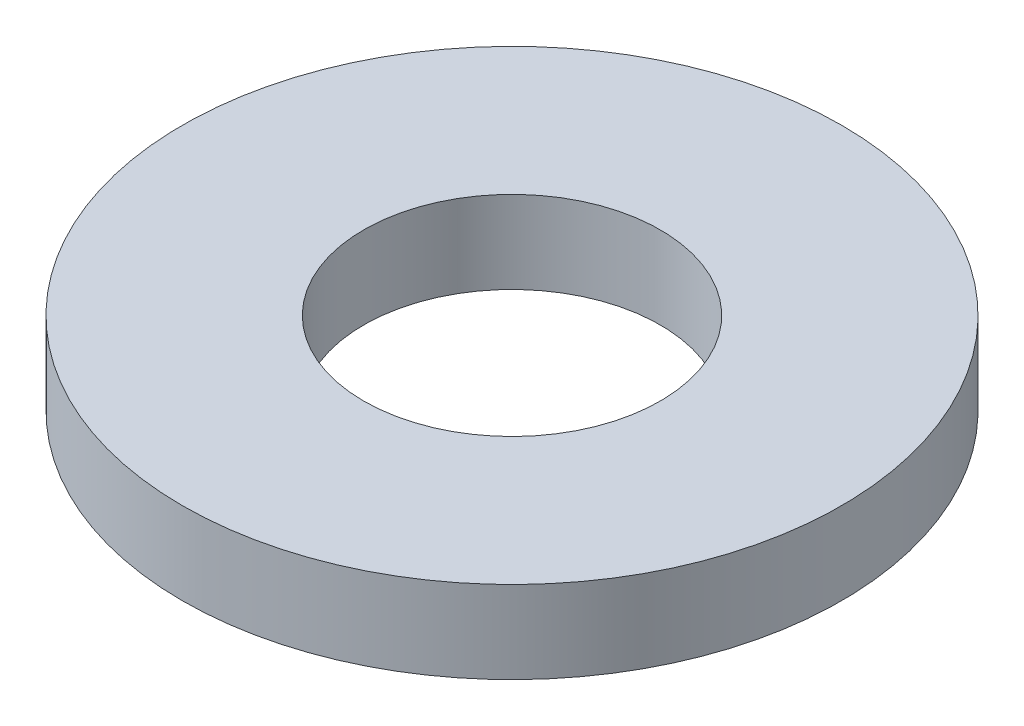
ISO-10303-21;
HEADER;
FILE_DESCRIPTION(('STEP AP214'),'2;1');
FILE_NAME('part.step','',(''),(''),'','','');
FILE_SCHEMA(('AUTOMOTIVE_DESIGN { 1 0 10303 214 1 1 1 1 }'));
ENDSEC;
DATA;
#1=APPLICATION_CONTEXT('core data for automotive mechanical design processes');
#2=APPLICATION_PROTOCOL_DEFINITION('international standard','automotive_design',2000,#1);
#3=PRODUCT_CONTEXT('',#1,'mechanical');
#4=PRODUCT('Part','Part','',(#3));
#5=PRODUCT_RELATED_PRODUCT_CATEGORY('part','',(#4));
#6=PRODUCT_DEFINITION_FORMATION('','',#4);
#7=PRODUCT_DEFINITION_CONTEXT('part definition',#1,'design');
#8=PRODUCT_DEFINITION('design','',#6,#7);
#9=PRODUCT_DEFINITION_SHAPE('','',#8);
#10=(LENGTH_UNIT() NAMED_UNIT(*) SI_UNIT(.MILLI.,.METRE.));
#11=(NAMED_UNIT(*) PLANE_ANGLE_UNIT() SI_UNIT($,.RADIAN.));
#12=(NAMED_UNIT(*) SI_UNIT($,.STERADIAN.) SOLID_ANGLE_UNIT());
#13=UNCERTAINTY_MEASURE_WITH_UNIT(LENGTH_MEASURE(1.E-05),#10,'distance_accuracy_value','');
#14=(GEOMETRIC_REPRESENTATION_CONTEXT(3) GLOBAL_UNCERTAINTY_ASSIGNED_CONTEXT((#13)) GLOBAL_UNIT_ASSIGNED_CONTEXT((#10,
#11,#12)) REPRESENTATION_CONTEXT('',''));
#15=CARTESIAN_POINT('',(0.,0.,0.));
#16=DIRECTION('',(0.,0.,1.));
#17=DIRECTION('',(1.,0.,0.));
#18=AXIS2_PLACEMENT_3D('',#15,#16,#17);
#19=CARTESIAN_POINT('',(0.,1.,0.));
#20=DIRECTION('',(0.,1.,0.));
#21=DIRECTION('',(0.,0.,1.));
#22=AXIS2_PLACEMENT_3D('',#19,#20,#21);
#23=PLANE('',#22);
#24=CARTESIAN_POINT('',(0.,1.,0.));
#25=DIRECTION('',(0.,1.,0.));
#26=DIRECTION('',(0.,0.,1.));
#27=AXIS2_PLACEMENT_3D('',#24,#25,#26);
#28=CIRCLE('',#27,4.);
#29=CARTESIAN_POINT('',(0.,1.,4.));
#30=VERTEX_POINT('',#29);
#31=EDGE_CURVE('E10',#30,#30,#28,.T.);
#32=ORIENTED_EDGE('',*,*,#31,.T.);
#33=EDGE_LOOP('',(#32));
#34=FACE_BOUND('',#33,.T.);
#35=CARTESIAN_POINT('',(0.,1.,0.));
#36=DIRECTION('',(0.,1.,0.));
#37=DIRECTION('',(0.,0.,1.));
#38=AXIS2_PLACEMENT_3D('',#35,#36,#37);
#39=CIRCLE('',#38,1.8);
#40=CARTESIAN_POINT('',(0.,1.,1.8));
#41=VERTEX_POINT('',#40);
#42=EDGE_CURVE('E44',#41,#41,#39,.T.);
#43=ORIENTED_EDGE('',*,*,#42,.F.);
#44=EDGE_LOOP('',(#43));
#45=FACE_BOUND('',#44,.T.);
#46=ADVANCED_FACE('F33',(#34,#45),#23,.T.);
#47=CARTESIAN_POINT('',(0.,0.,0.));
#48=DIRECTION('',(0.,1.,0.));
#49=DIRECTION('',(0.,0.,1.));
#50=AXIS2_PLACEMENT_3D('',#47,#48,#49);
#51=PLANE('',#50);
#52=CARTESIAN_POINT('',(0.,0.,0.));
#53=DIRECTION('',(0.,1.,0.));
#54=DIRECTION('',(0.,0.,1.));
#55=AXIS2_PLACEMENT_3D('',#52,#53,#54);
#56=CIRCLE('',#55,4.);
#57=CARTESIAN_POINT('',(0.,0.,4.));
#58=VERTEX_POINT('',#57);
#59=EDGE_CURVE('E37',#58,#58,#56,.T.);
#60=ORIENTED_EDGE('',*,*,#59,.F.);
#61=EDGE_LOOP('',(#60));
#62=FACE_BOUND('',#61,.T.);
#63=CARTESIAN_POINT('',(0.,0.,0.));
#64=DIRECTION('',(0.,1.,0.));
#65=DIRECTION('',(0.,0.,1.));
#66=AXIS2_PLACEMENT_3D('',#63,#64,#65);
#67=CIRCLE('',#66,1.8);
#68=CARTESIAN_POINT('',(0.,0.,1.8));
#69=VERTEX_POINT('',#68);
#70=EDGE_CURVE('E46',#69,#69,#67,.T.);
#71=ORIENTED_EDGE('',*,*,#70,.T.);
#72=EDGE_LOOP('',(#71));
#73=FACE_BOUND('',#72,.T.);
#74=ADVANCED_FACE('F56',(#62,#73),#51,.F.);
#75=CARTESIAN_POINT('',(0.,1.,0.));
#76=DIRECTION('',(0.,-1.,0.));
#77=DIRECTION('',(0.,0.,-1.));
#78=AXIS2_PLACEMENT_3D('',#75,#76,#77);
#79=CYLINDRICAL_SURFACE('',#78,4.);
#80=ORIENTED_EDGE('',*,*,#31,.F.);
#81=EDGE_LOOP('',(#80));
#82=FACE_BOUND('',#81,.T.);
#83=ORIENTED_EDGE('',*,*,#59,.T.);
#84=EDGE_LOOP('',(#83));
#85=FACE_BOUND('',#84,.T.);
#86=ADVANCED_FACE('F35',(#82,#85),#79,.T.);
#87=CARTESIAN_POINT('',(0.,1.,0.));
#88=DIRECTION('',(0.,-1.,0.));
#89=DIRECTION('',(0.,0.,-1.));
#90=AXIS2_PLACEMENT_3D('',#87,#88,#89);
#91=CYLINDRICAL_SURFACE('',#90,1.8);
#92=ORIENTED_EDGE('',*,*,#42,.T.);
#93=EDGE_LOOP('',(#92));
#94=FACE_BOUND('',#93,.T.);
#95=ORIENTED_EDGE('',*,*,#70,.F.);
#96=EDGE_LOOP('',(#95));
#97=FACE_BOUND('',#96,.T.);
#98=ADVANCED_FACE('F52',(#94,#97),#91,.F.);
#99=CLOSED_SHELL('',(#46,#74,#86,#98));
#100=MANIFOLD_SOLID_BREP('B2',#99);
#101=ADVANCED_BREP_SHAPE_REPRESENTATION('',(#18,#100),#14);
#102=SHAPE_DEFINITION_REPRESENTATION(#9,#101);
ENDSEC;
END-ISO-10303-21;
